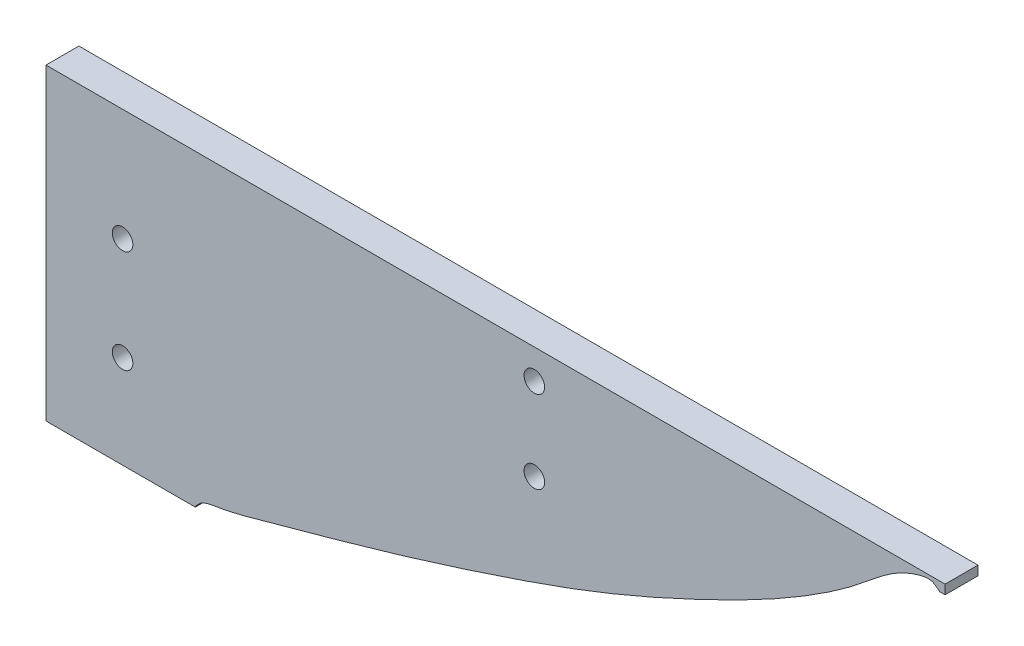
ISO-10303-21;
HEADER;
FILE_DESCRIPTION(('STEP AP214'),'2;1');
FILE_NAME('part.step','',(''),(''),'','','');
FILE_SCHEMA(('AUTOMOTIVE_DESIGN { 1 0 10303 214 1 1 1 1 }'));
ENDSEC;
DATA;
#1=APPLICATION_CONTEXT('core data for automotive mechanical design processes');
#2=APPLICATION_PROTOCOL_DEFINITION('international standard','automotive_design',2000,#1);
#3=PRODUCT_CONTEXT('',#1,'mechanical');
#4=PRODUCT('Part','Part','',(#3));
#5=PRODUCT_RELATED_PRODUCT_CATEGORY('part','',(#4));
#6=PRODUCT_DEFINITION_FORMATION('','',#4);
#7=PRODUCT_DEFINITION_CONTEXT('part definition',#1,'design');
#8=PRODUCT_DEFINITION('design','',#6,#7);
#9=PRODUCT_DEFINITION_SHAPE('','',#8);
#10=(LENGTH_UNIT() NAMED_UNIT(*) SI_UNIT(.MILLI.,.METRE.));
#11=(NAMED_UNIT(*) PLANE_ANGLE_UNIT() SI_UNIT($,.RADIAN.));
#12=(NAMED_UNIT(*) SI_UNIT($,.STERADIAN.) SOLID_ANGLE_UNIT());
#13=UNCERTAINTY_MEASURE_WITH_UNIT(LENGTH_MEASURE(1.E-05),#10,'distance_accuracy_value','');
#14=(GEOMETRIC_REPRESENTATION_CONTEXT(3) GLOBAL_UNCERTAINTY_ASSIGNED_CONTEXT((#13)) GLOBAL_UNIT_ASSIGNED_CONTEXT((#10,
#11,#12)) REPRESENTATION_CONTEXT('',''));
#15=CARTESIAN_POINT('',(0.,0.,0.));
#16=DIRECTION('',(0.,0.,1.));
#17=DIRECTION('',(1.,0.,0.));
#18=AXIS2_PLACEMENT_3D('',#15,#16,#17);
#19=CARTESIAN_POINT('',(11.6306691259562,-43.1183097120441,204.));
#20=DIRECTION('',(0.,0.,-1.));
#21=DIRECTION('',(-1.,0.,0.));
#22=AXIS2_PLACEMENT_3D('',#19,#20,#21);
#23=PLANE('',#22);
#24=CARTESIAN_POINT('',(-100.,-50.,204.));
#25=DIRECTION('',(0.,0.,-1.));
#26=DIRECTION('',(-1.,0.,0.));
#27=AXIS2_PLACEMENT_3D('',#24,#25,#26);
#28=CIRCLE('',#27,2.5);
#29=CARTESIAN_POINT('',(-102.5,-50.,204.));
#30=VERTEX_POINT('',#29);
#31=EDGE_CURVE('E242',#30,#30,#28,.F.);
#32=ORIENTED_EDGE('',*,*,#31,.F.);
#33=EDGE_LOOP('',(#32));
#34=FACE_BOUND('',#33,.T.);
#35=CARTESIAN_POINT('',(0.0705666698621599,-4.96037406111782,204.));
#36=DIRECTION('',(0.,0.,-1.));
#37=DIRECTION('',(-1.,0.,0.));
#38=AXIS2_PLACEMENT_3D('',#35,#36,#37);
#39=CIRCLE('',#38,2.5);
#40=CARTESIAN_POINT('',(-2.42943333013784,-4.96037406111782,204.));
#41=VERTEX_POINT('',#40);
#42=EDGE_CURVE('E238',#41,#41,#39,.F.);
#43=ORIENTED_EDGE('',*,*,#42,.F.);
#44=EDGE_LOOP('',(#43));
#45=FACE_BOUND('',#44,.T.);
#46=CARTESIAN_POINT('',(98.5359078748369,0.,204.));
#47=CARTESIAN_POINT('',(98.4813577236457,0.120838859806186,204.));
#48=CARTESIAN_POINT('',(98.389846657041,0.217972011429631,204.));
#49=CARTESIAN_POINT('',(98.1859008104522,0.384019108442481,204.));
#50=CARTESIAN_POINT('',(98.0767761486836,0.456701053241107,204.));
#51=CARTESIAN_POINT('',(97.7509744286432,0.677020424953802,204.));
#52=CARTESIAN_POINT('',(97.5385832598862,0.83188908025597,204.));
#53=CARTESIAN_POINT('',(97.1977823700618,1.02880543691943,204.));
#54=CARTESIAN_POINT('',(97.0822095753617,1.08951169559482,204.));
#55=CARTESIAN_POINT('',(96.8435746399014,1.19219598152308,204.));
#56=CARTESIAN_POINT('',(96.7201314846841,1.2332212250653,204.));
#57=CARTESIAN_POINT('',(96.4655740818258,1.29608899672647,204.));
#58=CARTESIAN_POINT('',(96.3346664999798,1.31786220665871,204.));
#59=CARTESIAN_POINT('',(96.0749201156565,1.3450035697983,204.));
#60=CARTESIAN_POINT('',(95.9449062635356,1.35071029569582,204.));
#61=CARTESIAN_POINT('',(95.5545639924026,1.35101824314538,204.));
#62=CARTESIAN_POINT('',(95.2928605297683,1.32925662781461,204.));
#63=CARTESIAN_POINT('',(94.774376132548,1.26232840859161,204.));
#64=CARTESIAN_POINT('',(94.5181761893457,1.21827727305105,204.));
#65=CARTESIAN_POINT('',(93.7573380084464,1.05911338732665,204.));
#66=CARTESIAN_POINT('',(93.2606242942487,0.916423354990876,204.));
#67=CARTESIAN_POINT('',(91.7853586471739,0.436586645504603,204.));
#68=CARTESIAN_POINT('',(90.8176439116109,0.0423301561062245,204.));
#69=CARTESIAN_POINT('',(88.9523687877505,-0.841967631030061,204.));
#70=CARTESIAN_POINT('',(88.052667066664,-1.33542429323367,204.));
#71=CARTESIAN_POINT('',(85.4494412067982,-2.96515597790482,204.));
#72=CARTESIAN_POINT('',(83.8371044160027,-4.24348352531141,204.));
#73=CARTESIAN_POINT('',(81.4414059225574,-6.19650333104075,204.));
#74=CARTESIAN_POINT('',(80.6460140926193,-6.85208361013709,204.));
#75=CARTESIAN_POINT('',(79.0420721794289,-8.1443000564362,204.));
#76=CARTESIAN_POINT('',(78.2350651523143,-8.783159566303,204.));
#77=CARTESIAN_POINT('',(75.7857129678311,-10.6589594684306,204.));
#78=CARTESIAN_POINT('',(74.1138563834792,-11.8534223235042,204.));
#79=CARTESIAN_POINT('',(70.7172864688481,-14.1662682022027,204.));
#80=CARTESIAN_POINT('',(68.9932216553668,-15.2855846742986,204.));
#81=CARTESIAN_POINT('',(65.5063009319677,-17.4683833058243,204.));
#82=CARTESIAN_POINT('',(63.742431976863,-18.5316181852129,204.));
#83=CARTESIAN_POINT('',(60.1777343948622,-20.5995284944532,204.));
#84=CARTESIAN_POINT('',(58.3791862750741,-21.6039442822995,204.));
#85=CARTESIAN_POINT('',(52.9456397551638,-24.5480773117471,204.));
#86=CARTESIAN_POINT('',(49.2742469571106,-26.4221728820499,204.));
#87=CARTESIAN_POINT('',(41.8816846959372,-30.0584923797548,204.));
#88=CARTESIAN_POINT('',(38.1579210650792,-31.8193054366951,204.));
#89=CARTESIAN_POINT('',(30.6642595485103,-35.2446649491548,204.));
#90=CARTESIAN_POINT('',(26.8944812890883,-36.9097834112614,204.));
#91=CARTESIAN_POINT('',(19.3030657202414,-40.1151408203646,204.));
#92=CARTESIAN_POINT('',(15.4793027675753,-41.6517188051604,204.));
#93=CARTESIAN_POINT('',(7.78203548433676,-44.5849006189279,204.));
#94=CARTESIAN_POINT('',(3.90790441205201,-45.98305274483,204.));
#95=CARTESIAN_POINT('',(-3.87313184219635,-48.6913865597844,204.));
#96=CARTESIAN_POINT('',(-7.77827364657464,-50.0051024925676,204.));
#97=CARTESIAN_POINT('',(-15.6031361041641,-52.5844202005527,204.));
#98=CARTESIAN_POINT('',(-19.5242689662651,-53.8474200905208,204.));
#99=CARTESIAN_POINT('',(-27.3869431202734,-56.3108951033392,204.));
#100=CARTESIAN_POINT('',(-31.3286599777688,-57.5093422187441,204.));
#101=CARTESIAN_POINT('',(-39.2300876048061,-59.8433691141169,204.));
#102=CARTESIAN_POINT('',(-43.1896781863934,-60.9802106476423,204.));
#103=CARTESIAN_POINT('',(-51.1190122563098,-63.2193842368819,204.));
#104=CARTESIAN_POINT('',(-55.0876089835881,-64.3252055452241,204.));
#105=CARTESIAN_POINT('',(-61.0423552915808,-65.9770740667396,204.));
#106=CARTESIAN_POINT('',(-63.0273274072463,-66.5274972630736,204.));
#107=CARTESIAN_POINT('',(-66.0074530914937,-67.3433855395342,204.));
#108=CARTESIAN_POINT('',(-67.0012888802328,-67.6136663572198,204.));
#109=CARTESIAN_POINT('',(-68.9896057771992,-68.1518713227879,204.));
#110=CARTESIAN_POINT('',(-69.983406548254,-68.4226855001096,204.));
#111=CARTESIAN_POINT('',(-71.9755363757982,-68.9452608878127,204.));
#112=CARTESIAN_POINT('',(-72.9746733209814,-69.1936454674721,204.));
#113=CARTESIAN_POINT('',(-74.4844932520025,-69.5195392747102,204.));
#114=CARTESIAN_POINT('',(-74.9896026804777,-69.6207075768334,204.));
#115=CARTESIAN_POINT('',(-76.0034309283807,-69.8067966694483,204.));
#116=CARTESIAN_POINT('',(-76.5125422598985,-69.8886449160652,204.));
#117=CARTESIAN_POINT('',(-77.531705522656,-70.0475483999638,204.));
#118=CARTESIAN_POINT('',(-78.0410226578292,-70.1283479339144,204.));
#119=CARTESIAN_POINT('',(-78.7981316695974,-70.2845377980473,204.));
#120=CARTESIAN_POINT('',(-79.0493898676897,-70.3422648109785,204.));
#121=CARTESIAN_POINT('',(-79.5483081366251,-70.4760537960072,204.));
#122=CARTESIAN_POINT('',(-79.7974314424247,-70.5531622771613,204.));
#123=CARTESIAN_POINT('',(-80.2797936245902,-70.7388820694984,204.));
#124=CARTESIAN_POINT('',(-80.5126993494693,-70.8472204727878,204.));
#125=CARTESIAN_POINT('',(-80.8438320714636,-71.0438183136422,204.));
#126=CARTESIAN_POINT('',(-80.9511127751798,-71.1151434115479,204.));
#127=CARTESIAN_POINT('',(-81.158556172308,-71.2711073593397,204.));
#128=CARTESIAN_POINT('',(-81.2591810704744,-71.3555448209625,204.));
#129=CARTESIAN_POINT('',(-81.5496984997827,-71.6175369653837,204.));
#130=CARTESIAN_POINT('',(-81.7263049760247,-71.8088659629694,204.));
#131=CARTESIAN_POINT('',(-81.9881917587024,-72.0988108112809,204.));
#132=CARTESIAN_POINT('',(-82.0746661503546,-72.1972292122369,204.));
#133=CARTESIAN_POINT('',(-82.227721426529,-72.4081460035601,204.));
#134=CARTESIAN_POINT('',(-82.293451368262,-72.5246052068099,204.));
#135=CARTESIAN_POINT('',(-82.3204186556791,-72.6518962505455,204.));
#136=B_SPLINE_CURVE_WITH_KNOTS('',3,(#46,#47,#48,#49,#50,#51,#52,#53,#54,#55,#56,#57,#58,#59,
#60,#61,#62,#63,#64,#65,#66,#67,#68,#69,#70,#71,#72,#73,#74,#75,#76,#77,#78,#79,#80,#81,#82,#83,
#84,#85,#86,#87,#88,#89,#90,#91,#92,#93,#94,#95,#96,#97,#98,#99,#100,#101,#102,#103,#104,#105,
#106,#107,#108,#109,#110,#111,#112,#113,#114,#115,#116,#117,#118,#119,#120,#121,#122,#123,#124,
#125,#126,#127,#128,#129,#130,#131,#132,#133,#134,#135),.UNSPECIFIED.,.F.,.F.,(4,2,2,2,2,2,2,2,
2,2,2,2,2,2,2,2,2,2,2,2,2,2,2,2,2,2,2,2,2,2,2,2,2,2,2,2,2,2,2,2,2,2,2,2,4),(0.,
0.00195312500000022,0.00390625000000044,0.00781250000000089,0.009765625000001,
0.0117187500000011,0.0136718750000013,0.0156250000000014,0.0195312500000014,0.0234375000000016,
0.0312500000000017,0.0468750000000017,0.0625000000000018,0.0937500000000018,0.109375000000002,
0.125000000000002,0.156250000000002,0.187500000000002,0.218750000000002,0.250000000000002,
0.312500000000002,0.375000000000001,0.437500000000001,0.500000000000001,0.562500000000001,
0.625000000000001,0.6875,0.75,0.8125,0.875,0.90625,0.921875,0.9375,0.953125,0.9609375,0.96875,
0.9765625,0.98046875,0.984375,0.98828125,0.990234375,0.9921875,0.99609375,0.998046875,1.),.UNSPECIFIED.);
#137=CARTESIAN_POINT('',(-82.3204186556791,-72.6518962505455,204.));
#138=VERTEX_POINT('',#137);
#139=CARTESIAN_POINT('',(98.5359078748382,0.,204.));
#140=VERTEX_POINT('',#139);
#141=EDGE_CURVE('E196',#138,#140,#136,.F.);
#142=ORIENTED_EDGE('',*,*,#141,.T.);
#143=DIRECTION('',(1.,0.,0.));
#144=VECTOR('',#143,1.);
#145=CARTESIAN_POINT('',(98.5359078748382,0.,204.));
#146=LINE('',#145,#144);
#147=CARTESIAN_POINT('',(99.8948082194346,0.,204.));
#148=VERTEX_POINT('',#147);
#149=EDGE_CURVE('E90',#140,#148,#146,.T.);
#150=ORIENTED_EDGE('',*,*,#149,.T.);
#151=DIRECTION('',(0.,1.,0.));
#152=VECTOR('',#151,1.);
#153=CARTESIAN_POINT('',(99.8948082194346,2.25600000000004,204.));
#154=LINE('',#153,#152);
#155=CARTESIAN_POINT('',(99.8948082194346,2.25600000000004,204.));
#156=VERTEX_POINT('',#155);
#157=EDGE_CURVE('E103',#148,#156,#154,.T.);
#158=ORIENTED_EDGE('',*,*,#157,.T.);
#159=DIRECTION('',(-1.,0.,0.));
#160=VECTOR('',#159,1.);
#161=CARTESIAN_POINT('',(99.8948082194346,2.25600000000004,204.));
#162=LINE('',#161,#160);
#163=CARTESIAN_POINT('',(-118.610432614062,2.25600000000002,204.));
#164=VERTEX_POINT('',#163);
#165=EDGE_CURVE('E97',#156,#164,#162,.T.);
#166=ORIENTED_EDGE('',*,*,#165,.T.);
#167=DIRECTION('',(0.,-1.,0.));
#168=VECTOR('',#167,1.);
#169=CARTESIAN_POINT('',(-118.610432614062,-72.6668459950364,204.));
#170=LINE('',#169,#168);
#171=CARTESIAN_POINT('',(-118.610432614062,-72.6668459950364,204.));
#172=VERTEX_POINT('',#171);
#173=EDGE_CURVE('E101',#164,#172,#170,.T.);
#174=ORIENTED_EDGE('',*,*,#173,.T.);
#175=CARTESIAN_POINT('',(-82.3204186556791,-72.6518962505455,204.));
#176=CARTESIAN_POINT('',(-94.4170890135902,-72.6594100240514,204.));
#177=CARTESIAN_POINT('',(-106.513760402535,-72.6642104113389,204.));
#178=CARTESIAN_POINT('',(-118.610432614062,-72.6668459950364,204.));
#179=B_SPLINE_CURVE_WITH_KNOTS('',3,(#175,#176,#177,#178),.UNSPECIFIED.,.F.,.F.,(4,4),(0.,1.),.UNSPECIFIED.);
#180=EDGE_CURVE('E51',#172,#138,#179,.F.);
#181=ORIENTED_EDGE('',*,*,#180,.T.);
#182=EDGE_LOOP('',(#142,#150,#158,#166,#174,#181));
#183=FACE_BOUND('',#182,.T.);
#184=CARTESIAN_POINT('',(0.0705666698621599,-25.,204.));
#185=DIRECTION('',(0.,0.,-1.));
#186=DIRECTION('',(-1.,0.,0.));
#187=AXIS2_PLACEMENT_3D('',#184,#185,#186);
#188=CIRCLE('',#187,2.5);
#189=CARTESIAN_POINT('',(-2.42943333013784,-25.,204.));
#190=VERTEX_POINT('',#189);
#191=EDGE_CURVE('E239',#190,#190,#188,.F.);
#192=ORIENTED_EDGE('',*,*,#191,.F.);
#193=EDGE_LOOP('',(#192));
#194=FACE_BOUND('',#193,.T.);
#195=CARTESIAN_POINT('',(-100.,-25.,204.));
#196=DIRECTION('',(0.,0.,-1.));
#197=DIRECTION('',(-1.,0.,0.));
#198=AXIS2_PLACEMENT_3D('',#195,#196,#197);
#199=CIRCLE('',#198,2.5);
#200=CARTESIAN_POINT('',(-102.5,-25.,204.));
#201=VERTEX_POINT('',#200);
#202=EDGE_CURVE('E245',#201,#201,#199,.F.);
#203=ORIENTED_EDGE('',*,*,#202,.F.);
#204=EDGE_LOOP('',(#203));
#205=FACE_BOUND('',#204,.T.);
#206=ADVANCED_FACE('F30',(#34,#45,#183,#194,#205),#23,.F.);
#207=CARTESIAN_POINT('',(11.6306691259562,-43.1183097120441,196.));
#208=DIRECTION('',(0.,0.,-1.));
#209=DIRECTION('',(-1.,0.,0.));
#210=AXIS2_PLACEMENT_3D('',#207,#208,#209);
#211=PLANE('',#210);
#212=CARTESIAN_POINT('',(-100.,-50.,196.));
#213=DIRECTION('',(0.,0.,-1.));
#214=DIRECTION('',(-1.,0.,0.));
#215=AXIS2_PLACEMENT_3D('',#212,#213,#214);
#216=CIRCLE('',#215,2.5);
#217=CARTESIAN_POINT('',(-102.5,-50.,196.));
#218=VERTEX_POINT('',#217);
#219=EDGE_CURVE('E243',#218,#218,#216,.F.);
#220=ORIENTED_EDGE('',*,*,#219,.T.);
#221=EDGE_LOOP('',(#220));
#222=FACE_BOUND('',#221,.T.);
#223=CARTESIAN_POINT('',(0.0705666698621599,-4.96037406111782,196.));
#224=DIRECTION('',(0.,0.,-1.));
#225=DIRECTION('',(-1.,0.,0.));
#226=AXIS2_PLACEMENT_3D('',#223,#224,#225);
#227=CIRCLE('',#226,2.5);
#228=CARTESIAN_POINT('',(-2.42943333013784,-4.96037406111782,196.));
#229=VERTEX_POINT('',#228);
#230=EDGE_CURVE('E235',#229,#229,#227,.F.);
#231=ORIENTED_EDGE('',*,*,#230,.T.);
#232=EDGE_LOOP('',(#231));
#233=FACE_BOUND('',#232,.T.);
#234=CARTESIAN_POINT('',(-82.3204186556791,-72.6518962505455,196.));
#235=CARTESIAN_POINT('',(-82.293451368262,-72.5246052068099,196.));
#236=CARTESIAN_POINT('',(-82.227721426529,-72.4081460035601,196.));
#237=CARTESIAN_POINT('',(-82.0746661503546,-72.1972292122369,196.));
#238=CARTESIAN_POINT('',(-81.9881917587024,-72.0988108112809,196.));
#239=CARTESIAN_POINT('',(-81.7263049760247,-71.8088659629694,196.));
#240=CARTESIAN_POINT('',(-81.5496984997827,-71.6175369653837,196.));
#241=CARTESIAN_POINT('',(-81.2591810704744,-71.3555448209625,196.));
#242=CARTESIAN_POINT('',(-81.158556172308,-71.2711073593397,196.));
#243=CARTESIAN_POINT('',(-80.9511127751798,-71.1151434115479,196.));
#244=CARTESIAN_POINT('',(-80.8438320714636,-71.0438183136422,196.));
#245=CARTESIAN_POINT('',(-80.5126993494693,-70.8472204727878,196.));
#246=CARTESIAN_POINT('',(-80.2797936245902,-70.7388820694984,196.));
#247=CARTESIAN_POINT('',(-79.7974314424247,-70.5531622771613,196.));
#248=CARTESIAN_POINT('',(-79.5483081366251,-70.4760537960072,196.));
#249=CARTESIAN_POINT('',(-79.0493898676897,-70.3422648109785,196.));
#250=CARTESIAN_POINT('',(-78.7981316695974,-70.2845377980473,196.));
#251=CARTESIAN_POINT('',(-78.0410226578292,-70.1283479339144,196.));
#252=CARTESIAN_POINT('',(-77.531705522656,-70.0475483999638,196.));
#253=CARTESIAN_POINT('',(-76.5125422598985,-69.8886449160652,196.));
#254=CARTESIAN_POINT('',(-76.0034309283807,-69.8067966694483,196.));
#255=CARTESIAN_POINT('',(-74.9896026804777,-69.6207075768334,196.));
#256=CARTESIAN_POINT('',(-74.4844932520025,-69.5195392747102,196.));
#257=CARTESIAN_POINT('',(-72.9746733209814,-69.1936454674721,196.));
#258=CARTESIAN_POINT('',(-71.9755363757982,-68.9452608878127,196.));
#259=CARTESIAN_POINT('',(-69.983406548254,-68.4226855001096,196.));
#260=CARTESIAN_POINT('',(-68.9896057771992,-68.1518713227879,196.));
#261=CARTESIAN_POINT('',(-67.0012888802328,-67.6136663572198,196.));
#262=CARTESIAN_POINT('',(-66.0074530914937,-67.3433855395342,196.));
#263=CARTESIAN_POINT('',(-63.0273274072463,-66.5274972630736,196.));
#264=CARTESIAN_POINT('',(-61.0423552915808,-65.9770740667396,196.));
#265=CARTESIAN_POINT('',(-55.0876089835881,-64.3252055452241,196.));
#266=CARTESIAN_POINT('',(-51.1190122563098,-63.2193842368819,196.));
#267=CARTESIAN_POINT('',(-43.1896781863934,-60.9802106476423,196.));
#268=CARTESIAN_POINT('',(-39.2300876048061,-59.8433691141169,196.));
#269=CARTESIAN_POINT('',(-31.3286599777688,-57.5093422187441,196.));
#270=CARTESIAN_POINT('',(-27.3869431202734,-56.3108951033392,196.));
#271=CARTESIAN_POINT('',(-19.5242689662651,-53.8474200905208,196.));
#272=CARTESIAN_POINT('',(-15.6031361041641,-52.5844202005527,196.));
#273=CARTESIAN_POINT('',(-7.77827364657464,-50.0051024925676,196.));
#274=CARTESIAN_POINT('',(-3.87313184219635,-48.6913865597844,196.));
#275=CARTESIAN_POINT('',(3.90790441205201,-45.98305274483,196.));
#276=CARTESIAN_POINT('',(7.78203548433676,-44.5849006189279,196.));
#277=CARTESIAN_POINT('',(15.4793027675753,-41.6517188051604,196.));
#278=CARTESIAN_POINT('',(19.3030657202414,-40.1151408203646,196.));
#279=CARTESIAN_POINT('',(26.8944812890883,-36.9097834112614,196.));
#280=CARTESIAN_POINT('',(30.6642595485103,-35.2446649491548,196.));
#281=CARTESIAN_POINT('',(38.1579210650792,-31.8193054366951,196.));
#282=CARTESIAN_POINT('',(41.8816846959372,-30.0584923797548,196.));
#283=CARTESIAN_POINT('',(49.2742469571106,-26.4221728820499,196.));
#284=CARTESIAN_POINT('',(52.9456397551638,-24.5480773117471,196.));
#285=CARTESIAN_POINT('',(58.3791862750741,-21.6039442822995,196.));
#286=CARTESIAN_POINT('',(60.1777343948622,-20.5995284944532,196.));
#287=CARTESIAN_POINT('',(63.742431976863,-18.5316181852129,196.));
#288=CARTESIAN_POINT('',(65.5063009319677,-17.4683833058243,196.));
#289=CARTESIAN_POINT('',(68.9932216553668,-15.2855846742986,196.));
#290=CARTESIAN_POINT('',(70.7172864688481,-14.1662682022027,196.));
#291=CARTESIAN_POINT('',(74.1138563834792,-11.8534223235042,196.));
#292=CARTESIAN_POINT('',(75.7857129678311,-10.6589594684306,196.));
#293=CARTESIAN_POINT('',(78.2350651523143,-8.783159566303,196.));
#294=CARTESIAN_POINT('',(79.0420721794289,-8.1443000564362,196.));
#295=CARTESIAN_POINT('',(80.6460140926193,-6.85208361013709,196.));
#296=CARTESIAN_POINT('',(81.4414059225574,-6.19650333104075,196.));
#297=CARTESIAN_POINT('',(83.8371044160027,-4.24348352531141,196.));
#298=CARTESIAN_POINT('',(85.4494412067982,-2.96515597790482,196.));
#299=CARTESIAN_POINT('',(88.052667066664,-1.33542429323367,196.));
#300=CARTESIAN_POINT('',(88.9523687877505,-0.841967631030061,196.));
#301=CARTESIAN_POINT('',(90.8176439116109,0.0423301561062245,196.));
#302=CARTESIAN_POINT('',(91.7853586471739,0.436586645504603,196.));
#303=CARTESIAN_POINT('',(93.2606242942487,0.916423354990876,196.));
#304=CARTESIAN_POINT('',(93.7573380084464,1.05911338732665,196.));
#305=CARTESIAN_POINT('',(94.5181761893457,1.21827727305105,196.));
#306=CARTESIAN_POINT('',(94.774376132548,1.26232840859161,196.));
#307=CARTESIAN_POINT('',(95.2928605297683,1.32925662781461,196.));
#308=CARTESIAN_POINT('',(95.5545639924026,1.35101824314538,196.));
#309=CARTESIAN_POINT('',(95.9449062635356,1.35071029569582,196.));
#310=CARTESIAN_POINT('',(96.0749201156565,1.3450035697983,196.));
#311=CARTESIAN_POINT('',(96.3346664999798,1.31786220665871,196.));
#312=CARTESIAN_POINT('',(96.4655740818258,1.29608899672647,196.));
#313=CARTESIAN_POINT('',(96.7201314846841,1.2332212250653,196.));
#314=CARTESIAN_POINT('',(96.8435746399014,1.19219598152308,196.));
#315=CARTESIAN_POINT('',(97.0822095753617,1.08951169559482,196.));
#316=CARTESIAN_POINT('',(97.1977823700618,1.02880543691943,196.));
#317=CARTESIAN_POINT('',(97.5385832598862,0.83188908025597,196.));
#318=CARTESIAN_POINT('',(97.7509744286432,0.677020424953802,196.));
#319=CARTESIAN_POINT('',(98.0767761486836,0.456701053241107,196.));
#320=CARTESIAN_POINT('',(98.1859008104522,0.384019108442481,196.));
#321=CARTESIAN_POINT('',(98.389846657041,0.217972011429631,196.));
#322=CARTESIAN_POINT('',(98.4813577236457,0.120838859806186,196.));
#323=CARTESIAN_POINT('',(98.5359078748369,0.,196.));
#324=B_SPLINE_CURVE_WITH_KNOTS('',3,(#234,#235,#236,#237,#238,#239,#240,#241,#242,#243,#244,
#245,#246,#247,#248,#249,#250,#251,#252,#253,#254,#255,#256,#257,#258,#259,#260,#261,#262,#263,
#264,#265,#266,#267,#268,#269,#270,#271,#272,#273,#274,#275,#276,#277,#278,#279,#280,#281,#282,
#283,#284,#285,#286,#287,#288,#289,#290,#291,#292,#293,#294,#295,#296,#297,#298,#299,#300,#301,
#302,#303,#304,#305,#306,#307,#308,#309,#310,#311,#312,#313,#314,#315,#316,#317,#318,#319,#320,
#321,#322,#323),.UNSPECIFIED.,.F.,.F.,(4,2,2,2,2,2,2,2,2,2,2,2,2,2,2,2,2,2,2,2,2,2,2,2,2,2,2,2,
2,2,2,2,2,2,2,2,2,2,2,2,2,2,2,2,4),(0.,0.00195312500000011,0.00390625000000022,
0.00781250000000033,0.00976562500000033,0.0117187500000003,0.0156250000000002,
0.0195312500000001,0.0234375,0.03125,0.0390625,0.046875,0.0625,0.078125,0.0937500000000001,
0.125,0.1875,0.25,0.3125,0.374999999999999,0.437499999999999,0.499999999999999,
0.562499999999999,0.624999999999999,0.687499999999998,0.749999999999998,0.781249999999998,
0.812499999999998,0.843749999999998,0.874999999999998,0.890624999999998,0.906249999999998,
0.937499999999998,0.953124999999998,0.968749999999998,0.976562499999998,0.980468749999999,
0.984374999999999,0.986328124999999,0.988281249999999,0.990234374999999,0.992187499999999,
0.99609375,0.998046875,1.),.UNSPECIFIED.);
#325=CARTESIAN_POINT('',(-82.3204186556791,-72.6518962505455,196.));
#326=VERTEX_POINT('',#325);
#327=CARTESIAN_POINT('',(98.5359078748382,0.,196.));
#328=VERTEX_POINT('',#327);
#329=EDGE_CURVE('E213',#326,#328,#324,.T.);
#330=ORIENTED_EDGE('',*,*,#329,.F.);
#331=CARTESIAN_POINT('',(-118.610432614062,-72.6668459950364,196.));
#332=CARTESIAN_POINT('',(-106.513760402535,-72.6642104113389,196.));
#333=CARTESIAN_POINT('',(-94.4170890135902,-72.6594100240514,196.));
#334=CARTESIAN_POINT('',(-82.3204186556791,-72.6518962505455,196.));
#335=B_SPLINE_CURVE_WITH_KNOTS('',3,(#331,#332,#333,#334),.UNSPECIFIED.,.F.,.F.,(4,4),(0.,1.),.UNSPECIFIED.);
#336=CARTESIAN_POINT('',(-118.610432614062,-72.6668459950364,196.));
#337=VERTEX_POINT('',#336);
#338=EDGE_CURVE('E81',#337,#326,#335,.T.);
#339=ORIENTED_EDGE('',*,*,#338,.F.);
#340=DIRECTION('',(0.,-1.,0.));
#341=VECTOR('',#340,1.);
#342=CARTESIAN_POINT('',(-118.610432614062,-72.6668459950364,196.));
#343=LINE('',#342,#341);
#344=CARTESIAN_POINT('',(-118.610432614062,2.25600000000002,196.));
#345=VERTEX_POINT('',#344);
#346=EDGE_CURVE('E75',#345,#337,#343,.T.);
#347=ORIENTED_EDGE('',*,*,#346,.F.);
#348=DIRECTION('',(-1.,0.,0.));
#349=VECTOR('',#348,1.);
#350=CARTESIAN_POINT('',(99.8948082194346,2.25600000000004,196.));
#351=LINE('',#350,#349);
#352=CARTESIAN_POINT('',(99.8948082194346,2.25600000000004,196.));
#353=VERTEX_POINT('',#352);
#354=EDGE_CURVE('E111',#353,#345,#351,.T.);
#355=ORIENTED_EDGE('',*,*,#354,.F.);
#356=DIRECTION('',(0.,1.,0.));
#357=VECTOR('',#356,1.);
#358=CARTESIAN_POINT('',(99.8948082194346,2.25600000000004,196.));
#359=LINE('',#358,#357);
#360=CARTESIAN_POINT('',(99.8948082194346,0.,196.));
#361=VERTEX_POINT('',#360);
#362=EDGE_CURVE('E158',#361,#353,#359,.T.);
#363=ORIENTED_EDGE('',*,*,#362,.F.);
#364=DIRECTION('',(1.,0.,0.));
#365=VECTOR('',#364,1.);
#366=CARTESIAN_POINT('',(98.5359078748382,0.,196.));
#367=LINE('',#366,#365);
#368=EDGE_CURVE('E163',#328,#361,#367,.T.);
#369=ORIENTED_EDGE('',*,*,#368,.F.);
#370=EDGE_LOOP('',(#330,#339,#347,#355,#363,#369));
#371=FACE_BOUND('',#370,.T.);
#372=CARTESIAN_POINT('',(0.0705666698621599,-25.,196.));
#373=DIRECTION('',(0.,0.,-1.));
#374=DIRECTION('',(-1.,0.,0.));
#375=AXIS2_PLACEMENT_3D('',#372,#373,#374);
#376=CIRCLE('',#375,2.5);
#377=CARTESIAN_POINT('',(-2.42943333013784,-25.,196.));
#378=VERTEX_POINT('',#377);
#379=EDGE_CURVE('E240',#378,#378,#376,.F.);
#380=ORIENTED_EDGE('',*,*,#379,.T.);
#381=EDGE_LOOP('',(#380));
#382=FACE_BOUND('',#381,.T.);
#383=CARTESIAN_POINT('',(-100.,-25.,196.));
#384=DIRECTION('',(0.,0.,-1.));
#385=DIRECTION('',(-1.,0.,0.));
#386=AXIS2_PLACEMENT_3D('',#383,#384,#385);
#387=CIRCLE('',#386,2.5);
#388=CARTESIAN_POINT('',(-102.5,-25.,196.));
#389=VERTEX_POINT('',#388);
#390=EDGE_CURVE('E36',#389,#389,#387,.F.);
#391=ORIENTED_EDGE('',*,*,#390,.T.);
#392=EDGE_LOOP('',(#391));
#393=FACE_BOUND('',#392,.T.);
#394=ADVANCED_FACE('F148',(#222,#233,#371,#382,#393),#211,.T.);
#395=CARTESIAN_POINT('',(-82.3204186556791,-72.6518962505455,204.));
#396=CARTESIAN_POINT('',(-82.293451368262,-72.5246052068099,204.));
#397=CARTESIAN_POINT('',(-82.227721426529,-72.4081460035601,204.));
#398=CARTESIAN_POINT('',(-82.0746661503546,-72.1972292122369,204.));
#399=CARTESIAN_POINT('',(-81.9881917587024,-72.0988108112809,204.));
#400=CARTESIAN_POINT('',(-81.7263049760247,-71.8088659629694,204.));
#401=CARTESIAN_POINT('',(-81.5496984997827,-71.6175369653837,204.));
#402=CARTESIAN_POINT('',(-81.2591810704744,-71.3555448209625,204.));
#403=CARTESIAN_POINT('',(-81.158556172308,-71.2711073593397,204.));
#404=CARTESIAN_POINT('',(-80.9511127751798,-71.1151434115479,204.));
#405=CARTESIAN_POINT('',(-80.8438320714636,-71.0438183136422,204.));
#406=CARTESIAN_POINT('',(-80.5126993494693,-70.8472204727878,204.));
#407=CARTESIAN_POINT('',(-80.2797936245902,-70.7388820694984,204.));
#408=CARTESIAN_POINT('',(-79.7974314424247,-70.5531622771613,204.));
#409=CARTESIAN_POINT('',(-79.5483081366251,-70.4760537960072,204.));
#410=CARTESIAN_POINT('',(-79.0493898676897,-70.3422648109785,204.));
#411=CARTESIAN_POINT('',(-78.7981316695974,-70.2845377980473,204.));
#412=CARTESIAN_POINT('',(-78.0410226578292,-70.1283479339144,204.));
#413=CARTESIAN_POINT('',(-77.531705522656,-70.0475483999638,204.));
#414=CARTESIAN_POINT('',(-76.5125422598985,-69.8886449160652,204.));
#415=CARTESIAN_POINT('',(-76.0034309283807,-69.8067966694483,204.));
#416=CARTESIAN_POINT('',(-74.9896026804777,-69.6207075768334,204.));
#417=CARTESIAN_POINT('',(-74.4844932520025,-69.5195392747102,204.));
#418=CARTESIAN_POINT('',(-72.9746733209814,-69.1936454674721,204.));
#419=CARTESIAN_POINT('',(-71.9755363757982,-68.9452608878127,204.));
#420=CARTESIAN_POINT('',(-69.983406548254,-68.4226855001096,204.));
#421=CARTESIAN_POINT('',(-68.9896057771992,-68.1518713227879,204.));
#422=CARTESIAN_POINT('',(-67.0012888802328,-67.6136663572198,204.));
#423=CARTESIAN_POINT('',(-66.0074530914937,-67.3433855395342,204.));
#424=CARTESIAN_POINT('',(-63.0273274072463,-66.5274972630736,204.));
#425=CARTESIAN_POINT('',(-61.0423552915808,-65.9770740667396,204.));
#426=CARTESIAN_POINT('',(-55.0876089835881,-64.3252055452241,204.));
#427=CARTESIAN_POINT('',(-51.1190122563098,-63.2193842368819,204.));
#428=CARTESIAN_POINT('',(-43.1896781863934,-60.9802106476423,204.));
#429=CARTESIAN_POINT('',(-39.2300876048061,-59.8433691141169,204.));
#430=CARTESIAN_POINT('',(-31.3286599777688,-57.5093422187441,204.));
#431=CARTESIAN_POINT('',(-27.3869431202734,-56.3108951033392,204.));
#432=CARTESIAN_POINT('',(-19.5242689662651,-53.8474200905208,204.));
#433=CARTESIAN_POINT('',(-15.6031361041641,-52.5844202005527,204.));
#434=CARTESIAN_POINT('',(-7.77827364657464,-50.0051024925676,204.));
#435=CARTESIAN_POINT('',(-3.87313184219635,-48.6913865597844,204.));
#436=CARTESIAN_POINT('',(3.90790441205201,-45.98305274483,204.));
#437=CARTESIAN_POINT('',(7.78203548433676,-44.5849006189279,204.));
#438=CARTESIAN_POINT('',(15.4793027675753,-41.6517188051604,204.));
#439=CARTESIAN_POINT('',(19.3030657202414,-40.1151408203646,204.));
#440=CARTESIAN_POINT('',(26.8944812890883,-36.9097834112614,204.));
#441=CARTESIAN_POINT('',(30.6642595485103,-35.2446649491548,204.));
#442=CARTESIAN_POINT('',(38.1579210650792,-31.8193054366951,204.));
#443=CARTESIAN_POINT('',(41.8816846959372,-30.0584923797548,204.));
#444=CARTESIAN_POINT('',(49.2742469571106,-26.4221728820499,204.));
#445=CARTESIAN_POINT('',(52.9456397551638,-24.5480773117471,204.));
#446=CARTESIAN_POINT('',(58.3791862750741,-21.6039442822995,204.));
#447=CARTESIAN_POINT('',(60.1777343948622,-20.5995284944532,204.));
#448=CARTESIAN_POINT('',(63.742431976863,-18.5316181852129,204.));
#449=CARTESIAN_POINT('',(65.5063009319677,-17.4683833058243,204.));
#450=CARTESIAN_POINT('',(68.9932216553668,-15.2855846742986,204.));
#451=CARTESIAN_POINT('',(70.7172864688481,-14.1662682022027,204.));
#452=CARTESIAN_POINT('',(74.1138563834792,-11.8534223235042,204.));
#453=CARTESIAN_POINT('',(75.7857129678311,-10.6589594684306,204.));
#454=CARTESIAN_POINT('',(78.2350651523143,-8.783159566303,204.));
#455=CARTESIAN_POINT('',(79.0420721794289,-8.1443000564362,204.));
#456=CARTESIAN_POINT('',(80.6460140926193,-6.85208361013709,204.));
#457=CARTESIAN_POINT('',(81.4414059225574,-6.19650333104075,204.));
#458=CARTESIAN_POINT('',(83.8371044160027,-4.24348352531141,204.));
#459=CARTESIAN_POINT('',(85.4494412067982,-2.96515597790482,204.));
#460=CARTESIAN_POINT('',(88.052667066664,-1.33542429323367,204.));
#461=CARTESIAN_POINT('',(88.9523687877505,-0.841967631030061,204.));
#462=CARTESIAN_POINT('',(90.8176439116109,0.0423301561062245,204.));
#463=CARTESIAN_POINT('',(91.7853586471739,0.436586645504603,204.));
#464=CARTESIAN_POINT('',(93.2606242942487,0.916423354990876,204.));
#465=CARTESIAN_POINT('',(93.7573380084464,1.05911338732665,204.));
#466=CARTESIAN_POINT('',(94.5181761893457,1.21827727305105,204.));
#467=CARTESIAN_POINT('',(94.774376132548,1.26232840859161,204.));
#468=CARTESIAN_POINT('',(95.2928605297683,1.32925662781461,204.));
#469=CARTESIAN_POINT('',(95.5545639924026,1.35101824314538,204.));
#470=CARTESIAN_POINT('',(95.9449062635356,1.35071029569582,204.));
#471=CARTESIAN_POINT('',(96.0749201156565,1.3450035697983,204.));
#472=CARTESIAN_POINT('',(96.3346664999798,1.31786220665871,204.));
#473=CARTESIAN_POINT('',(96.4655740818258,1.29608899672647,204.));
#474=CARTESIAN_POINT('',(96.7201314846841,1.2332212250653,204.));
#475=CARTESIAN_POINT('',(96.8435746399014,1.19219598152308,204.));
#476=CARTESIAN_POINT('',(97.0822095753617,1.08951169559482,204.));
#477=CARTESIAN_POINT('',(97.1977823700618,1.02880543691943,204.));
#478=CARTESIAN_POINT('',(97.5385832598862,0.83188908025597,204.));
#479=CARTESIAN_POINT('',(97.7509744286432,0.677020424953802,204.));
#480=CARTESIAN_POINT('',(98.0767761486836,0.456701053241107,204.));
#481=CARTESIAN_POINT('',(98.1859008104522,0.384019108442481,204.));
#482=CARTESIAN_POINT('',(98.389846657041,0.217972011429631,204.));
#483=CARTESIAN_POINT('',(98.4813577236457,0.120838859806186,204.));
#484=CARTESIAN_POINT('',(98.5359078748369,0.,204.));
#485=B_SPLINE_CURVE_WITH_KNOTS('',3,(#395,#396,#397,#398,#399,#400,#401,#402,#403,#404,#405,
#406,#407,#408,#409,#410,#411,#412,#413,#414,#415,#416,#417,#418,#419,#420,#421,#422,#423,#424,
#425,#426,#427,#428,#429,#430,#431,#432,#433,#434,#435,#436,#437,#438,#439,#440,#441,#442,#443,
#444,#445,#446,#447,#448,#449,#450,#451,#452,#453,#454,#455,#456,#457,#458,#459,#460,#461,#462,
#463,#464,#465,#466,#467,#468,#469,#470,#471,#472,#473,#474,#475,#476,#477,#478,#479,#480,#481,
#482,#483,#484),.UNSPECIFIED.,.F.,.F.,(4,2,2,2,2,2,2,2,2,2,2,2,2,2,2,2,2,2,2,2,2,2,2,2,2,2,2,2,
2,2,2,2,2,2,2,2,2,2,2,2,2,2,2,2,4),(0.,0.00195312500000011,0.00390625000000022,
0.00781250000000033,0.00976562500000033,0.0117187500000003,0.0156250000000002,
0.0195312500000001,0.0234375,0.03125,0.0390625,0.046875,0.0625,0.078125,0.0937500000000001,
0.125,0.1875,0.25,0.3125,0.374999999999999,0.437499999999999,0.499999999999999,
0.562499999999999,0.624999999999999,0.687499999999998,0.749999999999998,0.781249999999998,
0.812499999999998,0.843749999999998,0.874999999999998,0.890624999999998,0.906249999999998,
0.937499999999998,0.953124999999998,0.968749999999998,0.976562499999998,0.980468749999999,
0.984374999999999,0.986328124999999,0.988281249999999,0.990234374999999,0.992187499999999,
0.99609375,0.998046875,1.),.UNSPECIFIED.);
#486=DIRECTION('',(0.,0.,-1.));
#487=VECTOR('',#486,1.);
#488=SURFACE_OF_LINEAR_EXTRUSION('',#485,#487);
#489=ORIENTED_EDGE('',*,*,#329,.T.);
#490=DIRECTION('',(0.,0.,-1.));
#491=VECTOR('',#490,1.);
#492=CARTESIAN_POINT('',(98.5359078748382,0.,204.));
#493=LINE('',#492,#491);
#494=EDGE_CURVE('E11',#140,#328,#493,.T.);
#495=ORIENTED_EDGE('',*,*,#494,.F.);
#496=ORIENTED_EDGE('',*,*,#141,.F.);
#497=DIRECTION('',(0.,0.,-1.));
#498=VECTOR('',#497,1.);
#499=CARTESIAN_POINT('',(-82.3204186556791,-72.6518962505455,204.));
#500=LINE('',#499,#498);
#501=EDGE_CURVE('E117',#138,#326,#500,.T.);
#502=ORIENTED_EDGE('',*,*,#501,.T.);
#503=EDGE_LOOP('',(#489,#495,#496,#502));
#504=FACE_BOUND('',#503,.T.);
#505=ADVANCED_FACE('F32',(#504),#488,.F.);
#506=CARTESIAN_POINT('',(98.5359078748382,0.,204.));
#507=DIRECTION('',(0.,1.,0.));
#508=DIRECTION('',(-1.,0.,0.));
#509=AXIS2_PLACEMENT_3D('',#506,#507,#508);
#510=PLANE('',#509);
#511=ORIENTED_EDGE('',*,*,#368,.T.);
#512=DIRECTION('',(0.,0.,-1.));
#513=VECTOR('',#512,1.);
#514=CARTESIAN_POINT('',(99.8948082194346,0.,204.));
#515=LINE('',#514,#513);
#516=EDGE_CURVE('E42',#148,#361,#515,.T.);
#517=ORIENTED_EDGE('',*,*,#516,.F.);
#518=ORIENTED_EDGE('',*,*,#149,.F.);
#519=ORIENTED_EDGE('',*,*,#494,.T.);
#520=EDGE_LOOP('',(#511,#517,#518,#519));
#521=FACE_BOUND('',#520,.T.);
#522=ADVANCED_FACE('F338',(#521),#510,.F.);
#523=CARTESIAN_POINT('',(99.8948082194346,2.25600000000004,204.));
#524=DIRECTION('',(-1.,0.,0.));
#525=DIRECTION('',(0.,0.,1.));
#526=AXIS2_PLACEMENT_3D('',#523,#524,#525);
#527=PLANE('',#526);
#528=ORIENTED_EDGE('',*,*,#362,.T.);
#529=DIRECTION('',(0.,0.,-1.));
#530=VECTOR('',#529,1.);
#531=CARTESIAN_POINT('',(99.8948082194346,2.25600000000004,204.));
#532=LINE('',#531,#530);
#533=EDGE_CURVE('E112',#156,#353,#532,.T.);
#534=ORIENTED_EDGE('',*,*,#533,.F.);
#535=ORIENTED_EDGE('',*,*,#157,.F.);
#536=ORIENTED_EDGE('',*,*,#516,.T.);
#537=EDGE_LOOP('',(#528,#534,#535,#536));
#538=FACE_BOUND('',#537,.T.);
#539=ADVANCED_FACE('F330',(#538),#527,.F.);
#540=CARTESIAN_POINT('',(99.8948082194346,2.25600000000004,204.));
#541=DIRECTION('',(0.,-1.,0.));
#542=DIRECTION('',(1.,0.,0.));
#543=AXIS2_PLACEMENT_3D('',#540,#541,#542);
#544=PLANE('',#543);
#545=ORIENTED_EDGE('',*,*,#354,.T.);
#546=DIRECTION('',(0.,0.,-1.));
#547=VECTOR('',#546,1.);
#548=CARTESIAN_POINT('',(-118.610432614062,2.25600000000002,204.));
#549=LINE('',#548,#547);
#550=EDGE_CURVE('E108',#164,#345,#549,.T.);
#551=ORIENTED_EDGE('',*,*,#550,.F.);
#552=ORIENTED_EDGE('',*,*,#165,.F.);
#553=ORIENTED_EDGE('',*,*,#533,.T.);
#554=EDGE_LOOP('',(#545,#551,#552,#553));
#555=FACE_BOUND('',#554,.T.);
#556=ADVANCED_FACE('F109',(#555),#544,.F.);
#557=CARTESIAN_POINT('',(-118.610432614062,-72.6668459950364,204.));
#558=DIRECTION('',(1.,0.,0.));
#559=DIRECTION('',(0.,0.,-1.));
#560=AXIS2_PLACEMENT_3D('',#557,#558,#559);
#561=PLANE('',#560);
#562=ORIENTED_EDGE('',*,*,#346,.T.);
#563=DIRECTION('',(0.,0.,-1.));
#564=VECTOR('',#563,1.);
#565=CARTESIAN_POINT('',(-118.610432614062,-72.6668459950364,204.));
#566=LINE('',#565,#564);
#567=EDGE_CURVE('E113',#172,#337,#566,.T.);
#568=ORIENTED_EDGE('',*,*,#567,.F.);
#569=ORIENTED_EDGE('',*,*,#173,.F.);
#570=ORIENTED_EDGE('',*,*,#550,.T.);
#571=EDGE_LOOP('',(#562,#568,#569,#570));
#572=FACE_BOUND('',#571,.T.);
#573=ADVANCED_FACE('F115',(#572),#561,.F.);
#574=CARTESIAN_POINT('',(-118.610432614062,-72.6668459950364,204.));
#575=CARTESIAN_POINT('',(-106.513760402535,-72.6642104113389,204.));
#576=CARTESIAN_POINT('',(-94.4170890135902,-72.6594100240514,204.));
#577=CARTESIAN_POINT('',(-82.3204186556791,-72.6518962505455,204.));
#578=B_SPLINE_CURVE_WITH_KNOTS('',3,(#574,#575,#576,#577),.UNSPECIFIED.,.F.,.F.,(4,4),(0.,1.),.UNSPECIFIED.);
#579=DIRECTION('',(0.,0.,-1.));
#580=VECTOR('',#579,1.);
#581=SURFACE_OF_LINEAR_EXTRUSION('',#578,#580);
#582=ORIENTED_EDGE('',*,*,#338,.T.);
#583=ORIENTED_EDGE('',*,*,#501,.F.);
#584=ORIENTED_EDGE('',*,*,#180,.F.);
#585=ORIENTED_EDGE('',*,*,#567,.T.);
#586=EDGE_LOOP('',(#582,#583,#584,#585));
#587=FACE_BOUND('',#586,.T.);
#588=ADVANCED_FACE('F136',(#587),#581,.F.);
#589=CARTESIAN_POINT('',(0.0705666698621599,-4.96037406111782,308.));
#590=DIRECTION('',(0.,0.,-1.));
#591=DIRECTION('',(-1.,0.,0.));
#592=AXIS2_PLACEMENT_3D('',#589,#590,#591);
#593=CYLINDRICAL_SURFACE('',#592,2.5);
#594=ORIENTED_EDGE('',*,*,#230,.F.);
#595=EDGE_LOOP('',(#594));
#596=FACE_BOUND('',#595,.T.);
#597=ORIENTED_EDGE('',*,*,#42,.T.);
#598=EDGE_LOOP('',(#597));
#599=FACE_BOUND('',#598,.T.);
#600=ADVANCED_FACE('F147',(#596,#599),#593,.F.);
#601=CARTESIAN_POINT('',(0.0705666698621599,-25.,308.));
#602=DIRECTION('',(0.,0.,-1.));
#603=DIRECTION('',(-1.,0.,0.));
#604=AXIS2_PLACEMENT_3D('',#601,#602,#603);
#605=CYLINDRICAL_SURFACE('',#604,2.5);
#606=ORIENTED_EDGE('',*,*,#379,.F.);
#607=EDGE_LOOP('',(#606));
#608=FACE_BOUND('',#607,.T.);
#609=ORIENTED_EDGE('',*,*,#191,.T.);
#610=EDGE_LOOP('',(#609));
#611=FACE_BOUND('',#610,.T.);
#612=ADVANCED_FACE('F269',(#608,#611),#605,.F.);
#613=CARTESIAN_POINT('',(-100.,-50.,308.));
#614=DIRECTION('',(0.,0.,-1.));
#615=DIRECTION('',(-1.,0.,0.));
#616=AXIS2_PLACEMENT_3D('',#613,#614,#615);
#617=CYLINDRICAL_SURFACE('',#616,2.5);
#618=ORIENTED_EDGE('',*,*,#219,.F.);
#619=EDGE_LOOP('',(#618));
#620=FACE_BOUND('',#619,.T.);
#621=ORIENTED_EDGE('',*,*,#31,.T.);
#622=EDGE_LOOP('',(#621));
#623=FACE_BOUND('',#622,.T.);
#624=ADVANCED_FACE('F274',(#620,#623),#617,.F.);
#625=CARTESIAN_POINT('',(-100.,-25.,308.));
#626=DIRECTION('',(0.,0.,-1.));
#627=DIRECTION('',(-1.,0.,0.));
#628=AXIS2_PLACEMENT_3D('',#625,#626,#627);
#629=CYLINDRICAL_SURFACE('',#628,2.5);
#630=ORIENTED_EDGE('',*,*,#390,.F.);
#631=EDGE_LOOP('',(#630));
#632=FACE_BOUND('',#631,.T.);
#633=ORIENTED_EDGE('',*,*,#202,.T.);
#634=EDGE_LOOP('',(#633));
#635=FACE_BOUND('',#634,.T.);
#636=ADVANCED_FACE('F284',(#632,#635),#629,.F.);
#637=CLOSED_SHELL('',(#206,#394,#505,#522,#539,#556,#573,#588,#600,#612,#624,#636));
#638=MANIFOLD_SOLID_BREP('B2',#637);
#639=ADVANCED_BREP_SHAPE_REPRESENTATION('',(#18,#638),#14);
#640=SHAPE_DEFINITION_REPRESENTATION(#9,#639);
ENDSEC;
END-ISO-10303-21;
